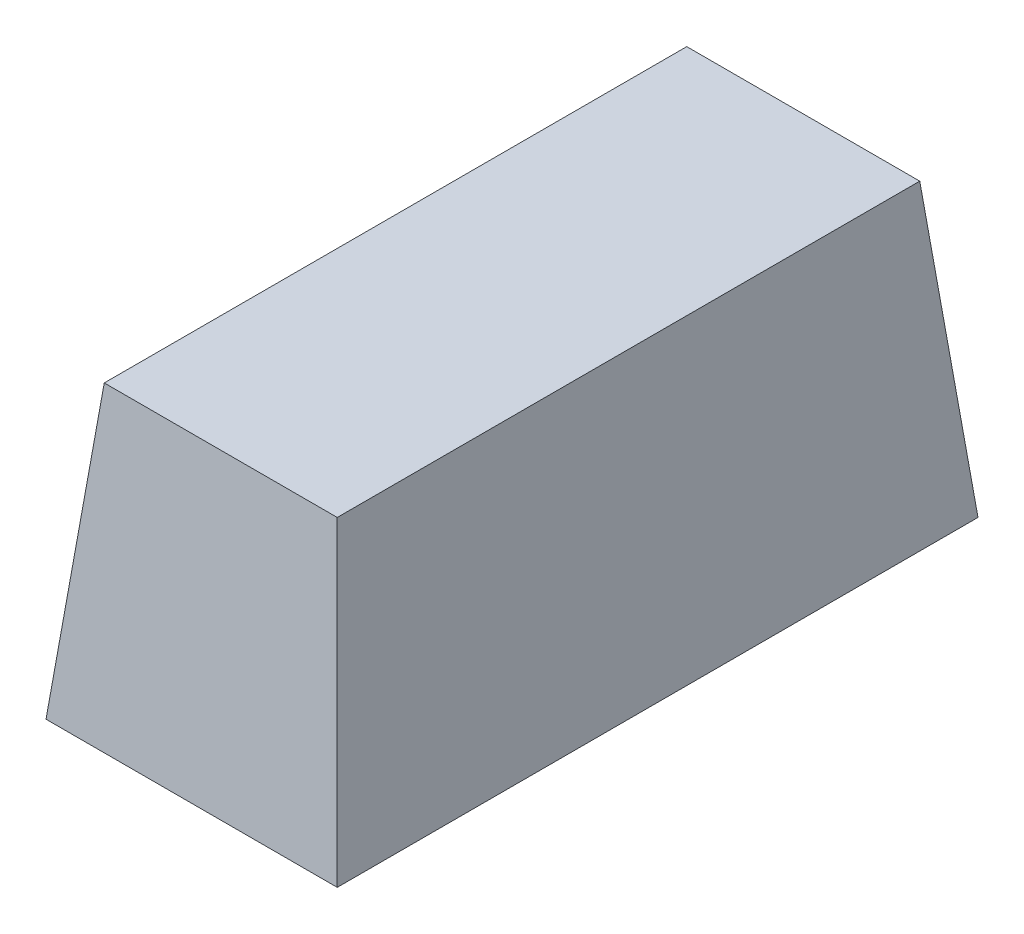
ISO-10303-21;
HEADER;
FILE_DESCRIPTION(('STEP AP214'),'2;1');
FILE_NAME('part.step','',(''),(''),'','','');
FILE_SCHEMA(('AUTOMOTIVE_DESIGN { 1 0 10303 214 1 1 1 1 }'));
ENDSEC;
DATA;
#1=APPLICATION_CONTEXT('core data for automotive mechanical design processes');
#2=APPLICATION_PROTOCOL_DEFINITION('international standard','automotive_design',2000,#1);
#3=PRODUCT_CONTEXT('',#1,'mechanical');
#4=PRODUCT('Part','Part','',(#3));
#5=PRODUCT_RELATED_PRODUCT_CATEGORY('part','',(#4));
#6=PRODUCT_DEFINITION_FORMATION('','',#4);
#7=PRODUCT_DEFINITION_CONTEXT('part definition',#1,'design');
#8=PRODUCT_DEFINITION('design','',#6,#7);
#9=PRODUCT_DEFINITION_SHAPE('','',#8);
#10=(LENGTH_UNIT() NAMED_UNIT(*) SI_UNIT(.MILLI.,.METRE.));
#11=(NAMED_UNIT(*) PLANE_ANGLE_UNIT() SI_UNIT($,.RADIAN.));
#12=(NAMED_UNIT(*) SI_UNIT($,.STERADIAN.) SOLID_ANGLE_UNIT());
#13=UNCERTAINTY_MEASURE_WITH_UNIT(LENGTH_MEASURE(1.E-05),#10,'distance_accuracy_value','');
#14=(GEOMETRIC_REPRESENTATION_CONTEXT(3) GLOBAL_UNCERTAINTY_ASSIGNED_CONTEXT((#13)) GLOBAL_UNIT_ASSIGNED_CONTEXT((#10,
#11,#12)) REPRESENTATION_CONTEXT('',''));
#15=CARTESIAN_POINT('',(0.,0.,0.));
#16=DIRECTION('',(0.,0.,1.));
#17=DIRECTION('',(1.,0.,0.));
#18=AXIS2_PLACEMENT_3D('',#15,#16,#17);
#19=CARTESIAN_POINT('',(0.,20.,0.));
#20=DIRECTION('',(0.,-1.,0.));
#21=DIRECTION('',(0.,0.,-1.));
#22=AXIS2_PLACEMENT_3D('',#19,#20,#21);
#23=PLANE('',#22);
#24=DIRECTION('',(0.,0.,1.));
#25=VECTOR('',#24,1.);
#26=CARTESIAN_POINT('',(18.,20.,-42.));
#27=LINE('',#26,#25);
#28=CARTESIAN_POINT('',(18.,20.,-42.));
#29=VERTEX_POINT('',#28);
#30=CARTESIAN_POINT('',(18.,20.,-1.99999999999999));
#31=VERTEX_POINT('',#30);
#32=EDGE_CURVE('E220',#29,#31,#27,.T.);
#33=ORIENTED_EDGE('',*,*,#32,.F.);
#34=DIRECTION('',(1.,0.,0.));
#35=VECTOR('',#34,1.);
#36=CARTESIAN_POINT('',(2.,20.,-42.));
#37=LINE('',#36,#35);
#38=CARTESIAN_POINT('',(2.,20.,-42.));
#39=VERTEX_POINT('',#38);
#40=EDGE_CURVE('E12',#39,#29,#37,.T.);
#41=ORIENTED_EDGE('',*,*,#40,.F.);
#42=DIRECTION('',(0.,0.,-1.));
#43=VECTOR('',#42,1.);
#44=CARTESIAN_POINT('',(2.,20.,-42.));
#45=LINE('',#44,#43);
#46=CARTESIAN_POINT('',(2.,20.,-1.99999999999999));
#47=VERTEX_POINT('',#46);
#48=EDGE_CURVE('E60',#47,#39,#45,.T.);
#49=ORIENTED_EDGE('',*,*,#48,.F.);
#50=DIRECTION('',(-1.,0.,0.));
#51=VECTOR('',#50,1.);
#52=CARTESIAN_POINT('',(2.,20.,-1.99999999999999));
#53=LINE('',#52,#51);
#54=EDGE_CURVE('E68',#31,#47,#53,.T.);
#55=ORIENTED_EDGE('',*,*,#54,.F.);
#56=EDGE_LOOP('',(#33,#41,#49,#55));
#57=FACE_BOUND('',#56,.T.);
#58=ADVANCED_FACE('F49',(#57),#23,.F.);
#59=CARTESIAN_POINT('',(0.,0.,0.));
#60=DIRECTION('',(0.,-1.,0.));
#61=DIRECTION('',(0.,0.,-1.));
#62=AXIS2_PLACEMENT_3D('',#59,#60,#61);
#63=PLANE('',#62);
#64=DIRECTION('',(0.,0.,1.));
#65=VECTOR('',#64,1.);
#66=CARTESIAN_POINT('',(0.,0.,0.));
#67=LINE('',#66,#65);
#68=CARTESIAN_POINT('',(0.,0.,-44.));
#69=VERTEX_POINT('',#68);
#70=CARTESIAN_POINT('',(0.,0.,0.));
#71=VERTEX_POINT('',#70);
#72=EDGE_CURVE('E100',#69,#71,#67,.T.);
#73=ORIENTED_EDGE('',*,*,#72,.F.);
#74=DIRECTION('',(-1.,0.,0.));
#75=VECTOR('',#74,1.);
#76=CARTESIAN_POINT('',(0.,0.,-44.));
#77=LINE('',#76,#75);
#78=CARTESIAN_POINT('',(20.,0.,-44.));
#79=VERTEX_POINT('',#78);
#80=EDGE_CURVE('E121',#79,#69,#77,.T.);
#81=ORIENTED_EDGE('',*,*,#80,.F.);
#82=DIRECTION('',(0.,0.,-1.));
#83=VECTOR('',#82,1.);
#84=CARTESIAN_POINT('',(20.,0.,0.));
#85=LINE('',#84,#83);
#86=CARTESIAN_POINT('',(20.,0.,0.));
#87=VERTEX_POINT('',#86);
#88=EDGE_CURVE('E102',#87,#79,#85,.T.);
#89=ORIENTED_EDGE('',*,*,#88,.F.);
#90=DIRECTION('',(1.,0.,0.));
#91=VECTOR('',#90,1.);
#92=CARTESIAN_POINT('',(0.,0.,0.));
#93=LINE('',#92,#91);
#94=EDGE_CURVE('E95',#71,#87,#93,.T.);
#95=ORIENTED_EDGE('',*,*,#94,.F.);
#96=EDGE_LOOP('',(#73,#81,#89,#95));
#97=FACE_BOUND('',#96,.T.);
#98=ADVANCED_FACE('F98',(#97),#63,.T.);
#99=CARTESIAN_POINT('',(0.,0.,0.));
#100=DIRECTION('',(-0.995037190209989,0.0995037190209992,0.));
#101=DIRECTION('',(-0.0995037190209992,-0.995037190209989,0.));
#102=AXIS2_PLACEMENT_3D('',#99,#100,#101);
#103=PLANE('',#102);
#104=DIRECTION('',(0.0990147542976677,0.990147542976674,-0.0990147542976672));
#105=VECTOR('',#104,1.);
#106=CARTESIAN_POINT('',(0.,0.,0.));
#107=LINE('',#106,#105);
#108=EDGE_CURVE('E109',#71,#47,#107,.T.);
#109=ORIENTED_EDGE('',*,*,#108,.T.);
#110=ORIENTED_EDGE('',*,*,#48,.T.);
#111=DIRECTION('',(0.0990147542976674,0.990147542976674,0.0990147542976675));
#112=VECTOR('',#111,1.);
#113=CARTESIAN_POINT('',(0.,0.,-44.));
#114=LINE('',#113,#112);
#115=EDGE_CURVE('E119',#69,#39,#114,.T.);
#116=ORIENTED_EDGE('',*,*,#115,.F.);
#117=ORIENTED_EDGE('',*,*,#72,.T.);
#118=EDGE_LOOP('',(#109,#110,#116,#117));
#119=FACE_BOUND('',#118,.T.);
#120=ADVANCED_FACE('F117',(#119),#103,.T.);
#121=CARTESIAN_POINT('',(0.,4.35643564356436,-43.5643564356436));
#122=DIRECTION('',(0.,0.099503719020999,-0.995037190209989));
#123=DIRECTION('',(0.,0.995037190209989,0.099503719020999));
#124=AXIS2_PLACEMENT_3D('',#121,#122,#123);
#125=PLANE('',#124);
#126=ORIENTED_EDGE('',*,*,#115,.T.);
#127=ORIENTED_EDGE('',*,*,#40,.T.);
#128=DIRECTION('',(-0.0990147542976674,0.990147542976674,0.0990147542976675));
#129=VECTOR('',#128,1.);
#130=CARTESIAN_POINT('',(20.,0.,-44.));
#131=LINE('',#130,#129);
#132=EDGE_CURVE('E141',#79,#29,#131,.T.);
#133=ORIENTED_EDGE('',*,*,#132,.F.);
#134=ORIENTED_EDGE('',*,*,#80,.T.);
#135=EDGE_LOOP('',(#126,#127,#133,#134));
#136=FACE_BOUND('',#135,.T.);
#137=ADVANCED_FACE('F246',(#136),#125,.T.);
#138=CARTESIAN_POINT('',(0.,0.,0.));
#139=DIRECTION('',(0.,0.0995037190209987,0.995037190209989));
#140=DIRECTION('',(0.,-0.995037190209989,0.0995037190209987));
#141=AXIS2_PLACEMENT_3D('',#138,#139,#140);
#142=PLANE('',#141);
#143=DIRECTION('',(-0.0990147542976672,0.990147542976674,-0.0990147542976672));
#144=VECTOR('',#143,1.);
#145=CARTESIAN_POINT('',(20.,0.,0.));
#146=LINE('',#145,#144);
#147=EDGE_CURVE('E130',#87,#31,#146,.T.);
#148=ORIENTED_EDGE('',*,*,#147,.T.);
#149=ORIENTED_EDGE('',*,*,#54,.T.);
#150=ORIENTED_EDGE('',*,*,#108,.F.);
#151=ORIENTED_EDGE('',*,*,#94,.T.);
#152=EDGE_LOOP('',(#148,#149,#150,#151));
#153=FACE_BOUND('',#152,.T.);
#154=ADVANCED_FACE('F125',(#153),#142,.T.);
#155=CARTESIAN_POINT('',(19.8019801980198,1.98019801980198,0.));
#156=DIRECTION('',(0.995037190209989,0.0995037190209989,0.));
#157=DIRECTION('',(-0.0995037190209989,0.995037190209989,0.));
#158=AXIS2_PLACEMENT_3D('',#155,#156,#157);
#159=PLANE('',#158);
#160=ORIENTED_EDGE('',*,*,#132,.T.);
#161=ORIENTED_EDGE('',*,*,#32,.T.);
#162=ORIENTED_EDGE('',*,*,#147,.F.);
#163=ORIENTED_EDGE('',*,*,#88,.T.);
#164=EDGE_LOOP('',(#160,#161,#162,#163));
#165=FACE_BOUND('',#164,.T.);
#166=ADVANCED_FACE('F151',(#165),#159,.T.);
#167=CLOSED_SHELL('',(#58,#98,#120,#137,#154,#166));
#168=MANIFOLD_SOLID_BREP('B2',#167);
#169=ADVANCED_BREP_SHAPE_REPRESENTATION('',(#18,#168),#14);
#170=SHAPE_DEFINITION_REPRESENTATION(#9,#169);
ENDSEC;
END-ISO-10303-21;
